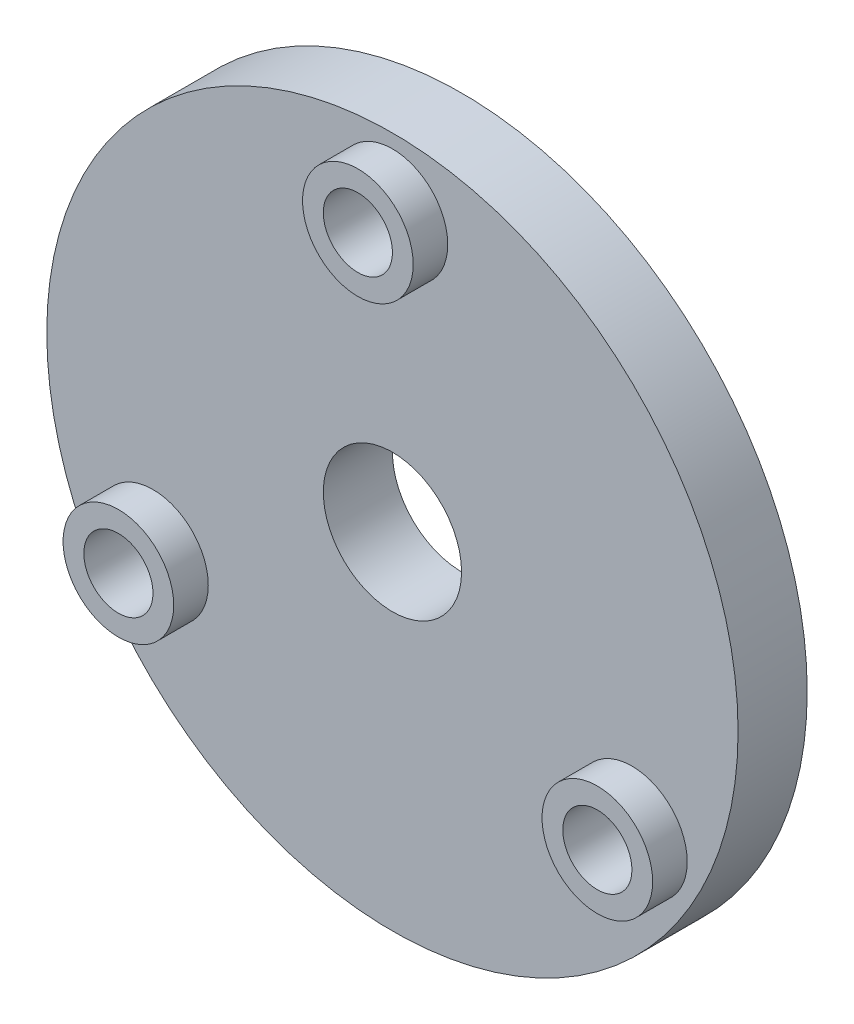
ISO-10303-21;
HEADER;
FILE_DESCRIPTION(('STEP AP214'),'2;1');
FILE_NAME('part.step','',(''),(''),'','','');
FILE_SCHEMA(('AUTOMOTIVE_DESIGN { 1 0 10303 214 1 1 1 1 }'));
ENDSEC;
DATA;
#1=APPLICATION_CONTEXT('core data for automotive mechanical design processes');
#2=APPLICATION_PROTOCOL_DEFINITION('international standard','automotive_design',2000,#1);
#3=PRODUCT_CONTEXT('',#1,'mechanical');
#4=PRODUCT('Part','Part','',(#3));
#5=PRODUCT_RELATED_PRODUCT_CATEGORY('part','',(#4));
#6=PRODUCT_DEFINITION_FORMATION('','',#4);
#7=PRODUCT_DEFINITION_CONTEXT('part definition',#1,'design');
#8=PRODUCT_DEFINITION('design','',#6,#7);
#9=PRODUCT_DEFINITION_SHAPE('','',#8);
#10=(LENGTH_UNIT() NAMED_UNIT(*) SI_UNIT(.MILLI.,.METRE.));
#11=(NAMED_UNIT(*) PLANE_ANGLE_UNIT() SI_UNIT($,.RADIAN.));
#12=(NAMED_UNIT(*) SI_UNIT($,.STERADIAN.) SOLID_ANGLE_UNIT());
#13=UNCERTAINTY_MEASURE_WITH_UNIT(LENGTH_MEASURE(1.E-05),#10,'distance_accuracy_value','');
#14=(GEOMETRIC_REPRESENTATION_CONTEXT(3) GLOBAL_UNCERTAINTY_ASSIGNED_CONTEXT((#13)) GLOBAL_UNIT_ASSIGNED_CONTEXT((#10,
#11,#12)) REPRESENTATION_CONTEXT('',''));
#15=CARTESIAN_POINT('',(0.,0.,0.));
#16=DIRECTION('',(0.,0.,1.));
#17=DIRECTION('',(1.,0.,0.));
#18=AXIS2_PLACEMENT_3D('',#15,#16,#17);
#19=CARTESIAN_POINT('',(0.,0.,10.));
#20=DIRECTION('',(0.,0.,1.));
#21=DIRECTION('',(1.,0.,0.));
#22=AXIS2_PLACEMENT_3D('',#19,#20,#21);
#23=PLANE('',#22);
#24=CARTESIAN_POINT('',(-34.6410161513774,-20.0000000000003,10.));
#25=DIRECTION('',(0.,0.,1.));
#26=DIRECTION('',(-0.500000000000004,0.866025403784436,0.));
#27=AXIS2_PLACEMENT_3D('',#24,#25,#26);
#28=CIRCLE('',#27,8.);
#29=CARTESIAN_POINT('',(-38.6410161513774,-13.0717967697248,10.));
#30=VERTEX_POINT('',#29);
#31=EDGE_CURVE('E74',#30,#30,#28,.T.);
#32=ORIENTED_EDGE('',*,*,#31,.F.);
#33=EDGE_LOOP('',(#32));
#34=FACE_BOUND('',#33,.T.);
#35=CARTESIAN_POINT('',(0.,0.,10.));
#36=DIRECTION('',(0.,0.,1.));
#37=DIRECTION('',(1.,0.,0.));
#38=AXIS2_PLACEMENT_3D('',#35,#36,#37);
#39=CIRCLE('',#38,10.);
#40=CARTESIAN_POINT('',(10.,0.,10.));
#41=VERTEX_POINT('',#40);
#42=EDGE_CURVE('E48',#41,#41,#39,.T.);
#43=ORIENTED_EDGE('',*,*,#42,.F.);
#44=EDGE_LOOP('',(#43));
#45=FACE_BOUND('',#44,.T.);
#46=CARTESIAN_POINT('',(0.,0.,10.));
#47=DIRECTION('',(0.,0.,1.));
#48=DIRECTION('',(1.,0.,0.));
#49=AXIS2_PLACEMENT_3D('',#46,#47,#48);
#50=CIRCLE('',#49,50.);
#51=CARTESIAN_POINT('',(50.,0.,10.));
#52=VERTEX_POINT('',#51);
#53=EDGE_CURVE('E10',#52,#52,#50,.T.);
#54=ORIENTED_EDGE('',*,*,#53,.T.);
#55=EDGE_LOOP('',(#54));
#56=FACE_BOUND('',#55,.T.);
#57=CARTESIAN_POINT('',(-1.5182299861749E-13,40.,10.));
#58=DIRECTION('',(0.,0.,1.));
#59=DIRECTION('',(1.,0.,0.));
#60=AXIS2_PLACEMENT_3D('',#57,#58,#59);
#61=CIRCLE('',#60,8.);
#62=CARTESIAN_POINT('',(7.99999999999985,40.,10.));
#63=VERTEX_POINT('',#62);
#64=EDGE_CURVE('E65',#63,#63,#61,.T.);
#65=ORIENTED_EDGE('',*,*,#64,.F.);
#66=EDGE_LOOP('',(#65));
#67=FACE_BOUND('',#66,.T.);
#68=CARTESIAN_POINT('',(34.6410161513778,-19.9999999999995,10.));
#69=DIRECTION('',(0.,0.,1.));
#70=DIRECTION('',(-0.499999999999992,-0.866025403784443,0.));
#71=AXIS2_PLACEMENT_3D('',#68,#69,#70);
#72=CIRCLE('',#71,8.);
#73=CARTESIAN_POINT('',(30.6410161513779,-26.9282032302751,10.));
#74=VERTEX_POINT('',#73);
#75=EDGE_CURVE('E83',#74,#74,#72,.T.);
#76=ORIENTED_EDGE('',*,*,#75,.F.);
#77=EDGE_LOOP('',(#76));
#78=FACE_BOUND('',#77,.T.);
#79=ADVANCED_FACE('F37',(#34,#45,#56,#67,#78),#23,.T.);
#80=CARTESIAN_POINT('',(0.,0.,0.));
#81=DIRECTION('',(0.,0.,1.));
#82=DIRECTION('',(1.,0.,0.));
#83=AXIS2_PLACEMENT_3D('',#80,#81,#82);
#84=PLANE('',#83);
#85=CARTESIAN_POINT('',(-34.6410161513774,-20.0000000000003,0.));
#86=DIRECTION('',(0.,0.,1.));
#87=DIRECTION('',(-0.500000000000004,0.866025403784436,0.));
#88=AXIS2_PLACEMENT_3D('',#85,#86,#87);
#89=CIRCLE('',#88,5.);
#90=CARTESIAN_POINT('',(-37.1410161513774,-15.6698729810781,0.));
#91=VERTEX_POINT('',#90);
#92=EDGE_CURVE('E58',#91,#91,#89,.T.);
#93=ORIENTED_EDGE('',*,*,#92,.T.);
#94=EDGE_LOOP('',(#93));
#95=FACE_BOUND('',#94,.T.);
#96=CARTESIAN_POINT('',(34.6410161513778,-19.9999999999995,0.));
#97=DIRECTION('',(0.,0.,1.));
#98=DIRECTION('',(-0.499999999999992,-0.866025403784443,0.));
#99=AXIS2_PLACEMENT_3D('',#96,#97,#98);
#100=CIRCLE('',#99,5.);
#101=CARTESIAN_POINT('',(32.1410161513778,-24.3301270189218,0.));
#102=VERTEX_POINT('',#101);
#103=EDGE_CURVE('E59',#102,#102,#100,.T.);
#104=ORIENTED_EDGE('',*,*,#103,.T.);
#105=EDGE_LOOP('',(#104));
#106=FACE_BOUND('',#105,.T.);
#107=CARTESIAN_POINT('',(-1.5182299861749E-13,40.,0.));
#108=DIRECTION('',(0.,0.,1.));
#109=DIRECTION('',(1.,0.,0.));
#110=AXIS2_PLACEMENT_3D('',#107,#108,#109);
#111=CIRCLE('',#110,5.);
#112=CARTESIAN_POINT('',(4.99999999999985,40.,0.));
#113=VERTEX_POINT('',#112);
#114=EDGE_CURVE('E53',#113,#113,#111,.T.);
#115=ORIENTED_EDGE('',*,*,#114,.T.);
#116=EDGE_LOOP('',(#115));
#117=FACE_BOUND('',#116,.T.);
#118=CARTESIAN_POINT('',(0.,0.,0.));
#119=DIRECTION('',(0.,0.,1.));
#120=DIRECTION('',(1.,0.,0.));
#121=AXIS2_PLACEMENT_3D('',#118,#119,#120);
#122=CIRCLE('',#121,50.);
#123=CARTESIAN_POINT('',(50.,0.,0.));
#124=VERTEX_POINT('',#123);
#125=EDGE_CURVE('E41',#124,#124,#122,.T.);
#126=ORIENTED_EDGE('',*,*,#125,.F.);
#127=EDGE_LOOP('',(#126));
#128=FACE_BOUND('',#127,.T.);
#129=CARTESIAN_POINT('',(0.,0.,0.));
#130=DIRECTION('',(0.,0.,1.));
#131=DIRECTION('',(1.,0.,0.));
#132=AXIS2_PLACEMENT_3D('',#129,#130,#131);
#133=CIRCLE('',#132,10.);
#134=CARTESIAN_POINT('',(10.,0.,0.));
#135=VERTEX_POINT('',#134);
#136=EDGE_CURVE('E50',#135,#135,#133,.T.);
#137=ORIENTED_EDGE('',*,*,#136,.T.);
#138=EDGE_LOOP('',(#137));
#139=FACE_BOUND('',#138,.T.);
#140=ADVANCED_FACE('F110',(#95,#106,#117,#128,#139),#84,.F.);
#141=CARTESIAN_POINT('',(0.,0.,10.));
#142=DIRECTION('',(0.,0.,-1.));
#143=DIRECTION('',(-1.,0.,0.));
#144=AXIS2_PLACEMENT_3D('',#141,#142,#143);
#145=CYLINDRICAL_SURFACE('',#144,50.);
#146=ORIENTED_EDGE('',*,*,#53,.F.);
#147=EDGE_LOOP('',(#146));
#148=FACE_BOUND('',#147,.T.);
#149=ORIENTED_EDGE('',*,*,#125,.T.);
#150=EDGE_LOOP('',(#149));
#151=FACE_BOUND('',#150,.T.);
#152=ADVANCED_FACE('F39',(#148,#151),#145,.T.);
#153=CARTESIAN_POINT('',(0.,0.,10.));
#154=DIRECTION('',(0.,0.,-1.));
#155=DIRECTION('',(-1.,0.,0.));
#156=AXIS2_PLACEMENT_3D('',#153,#154,#155);
#157=CYLINDRICAL_SURFACE('',#156,10.);
#158=ORIENTED_EDGE('',*,*,#42,.T.);
#159=EDGE_LOOP('',(#158));
#160=FACE_BOUND('',#159,.T.);
#161=ORIENTED_EDGE('',*,*,#136,.F.);
#162=EDGE_LOOP('',(#161));
#163=FACE_BOUND('',#162,.T.);
#164=ADVANCED_FACE('F122',(#160,#163),#157,.F.);
#165=CARTESIAN_POINT('',(-1.5182299861749E-13,40.,10.));
#166=DIRECTION('',(0.,0.,-1.));
#167=DIRECTION('',(-1.,0.,0.));
#168=AXIS2_PLACEMENT_3D('',#165,#166,#167);
#169=CYLINDRICAL_SURFACE('',#168,5.);
#170=ORIENTED_EDGE('',*,*,#114,.F.);
#171=EDGE_LOOP('',(#170));
#172=FACE_BOUND('',#171,.T.);
#173=CARTESIAN_POINT('',(-1.5182299861749E-13,40.,15.));
#174=DIRECTION('',(0.,0.,1.));
#175=DIRECTION('',(1.,0.,0.));
#176=AXIS2_PLACEMENT_3D('',#173,#174,#175);
#177=CIRCLE('',#176,5.);
#178=CARTESIAN_POINT('',(4.99999999999985,40.,15.));
#179=VERTEX_POINT('',#178);
#180=EDGE_CURVE('E68',#179,#179,#177,.T.);
#181=ORIENTED_EDGE('',*,*,#180,.T.);
#182=EDGE_LOOP('',(#181));
#183=FACE_BOUND('',#182,.T.);
#184=ADVANCED_FACE('F125',(#172,#183),#169,.F.);
#185=CARTESIAN_POINT('',(34.6410161513778,-19.9999999999995,10.));
#186=DIRECTION('',(0.,0.,-1.));
#187=DIRECTION('',(-1.,0.,0.));
#188=AXIS2_PLACEMENT_3D('',#185,#186,#187);
#189=CYLINDRICAL_SURFACE('',#188,5.);
#190=ORIENTED_EDGE('',*,*,#103,.F.);
#191=EDGE_LOOP('',(#190));
#192=FACE_BOUND('',#191,.T.);
#193=CARTESIAN_POINT('',(34.6410161513778,-19.9999999999995,15.));
#194=DIRECTION('',(0.,0.,1.));
#195=DIRECTION('',(-0.499999999999992,-0.866025403784443,0.));
#196=AXIS2_PLACEMENT_3D('',#193,#194,#195);
#197=CIRCLE('',#196,5.);
#198=CARTESIAN_POINT('',(32.1410161513778,-24.3301270189218,15.));
#199=VERTEX_POINT('',#198);
#200=EDGE_CURVE('E86',#199,#199,#197,.T.);
#201=ORIENTED_EDGE('',*,*,#200,.T.);
#202=EDGE_LOOP('',(#201));
#203=FACE_BOUND('',#202,.T.);
#204=ADVANCED_FACE('F92',(#192,#203),#189,.F.);
#205=CARTESIAN_POINT('',(-34.6410161513774,-20.0000000000003,10.));
#206=DIRECTION('',(0.,0.,-1.));
#207=DIRECTION('',(-1.,0.,0.));
#208=AXIS2_PLACEMENT_3D('',#205,#206,#207);
#209=CYLINDRICAL_SURFACE('',#208,5.);
#210=ORIENTED_EDGE('',*,*,#92,.F.);
#211=EDGE_LOOP('',(#210));
#212=FACE_BOUND('',#211,.T.);
#213=CARTESIAN_POINT('',(-34.6410161513774,-20.0000000000003,15.));
#214=DIRECTION('',(0.,0.,1.));
#215=DIRECTION('',(-0.500000000000004,0.866025403784436,0.));
#216=AXIS2_PLACEMENT_3D('',#213,#214,#215);
#217=CIRCLE('',#216,5.);
#218=CARTESIAN_POINT('',(-37.1410161513774,-15.6698729810781,15.));
#219=VERTEX_POINT('',#218);
#220=EDGE_CURVE('E77',#219,#219,#217,.T.);
#221=ORIENTED_EDGE('',*,*,#220,.T.);
#222=EDGE_LOOP('',(#221));
#223=FACE_BOUND('',#222,.T.);
#224=ADVANCED_FACE('F131',(#212,#223),#209,.F.);
#225=CARTESIAN_POINT('',(-1.5182299861749E-13,40.,15.));
#226=DIRECTION('',(0.,0.,1.));
#227=DIRECTION('',(1.,0.,0.));
#228=AXIS2_PLACEMENT_3D('',#225,#226,#227);
#229=PLANE('',#228);
#230=CARTESIAN_POINT('',(-1.5182299861749E-13,40.,15.));
#231=DIRECTION('',(0.,0.,1.));
#232=DIRECTION('',(1.,0.,0.));
#233=AXIS2_PLACEMENT_3D('',#230,#231,#232);
#234=CIRCLE('',#233,8.);
#235=CARTESIAN_POINT('',(7.99999999999985,40.,15.));
#236=VERTEX_POINT('',#235);
#237=EDGE_CURVE('E62',#236,#236,#234,.T.);
#238=ORIENTED_EDGE('',*,*,#237,.T.);
#239=EDGE_LOOP('',(#238));
#240=FACE_BOUND('',#239,.T.);
#241=ORIENTED_EDGE('',*,*,#180,.F.);
#242=EDGE_LOOP('',(#241));
#243=FACE_BOUND('',#242,.T.);
#244=ADVANCED_FACE('F135',(#240,#243),#229,.T.);
#245=CARTESIAN_POINT('',(-1.5182299861749E-13,40.,15.));
#246=DIRECTION('',(0.,0.,-1.));
#247=DIRECTION('',(-1.,0.,0.));
#248=AXIS2_PLACEMENT_3D('',#245,#246,#247);
#249=CYLINDRICAL_SURFACE('',#248,8.);
#250=ORIENTED_EDGE('',*,*,#237,.F.);
#251=EDGE_LOOP('',(#250));
#252=FACE_BOUND('',#251,.T.);
#253=ORIENTED_EDGE('',*,*,#64,.T.);
#254=EDGE_LOOP('',(#253));
#255=FACE_BOUND('',#254,.T.);
#256=ADVANCED_FACE('F137',(#252,#255),#249,.T.);
#257=CARTESIAN_POINT('',(-34.6410161513774,-20.0000000000003,15.));
#258=DIRECTION('',(0.,0.,1.));
#259=DIRECTION('',(-0.500000000000004,0.866025403784436,0.));
#260=AXIS2_PLACEMENT_3D('',#257,#258,#259);
#261=PLANE('',#260);
#262=CARTESIAN_POINT('',(-34.6410161513774,-20.0000000000003,15.));
#263=DIRECTION('',(0.,0.,1.));
#264=DIRECTION('',(-0.500000000000004,0.866025403784436,0.));
#265=AXIS2_PLACEMENT_3D('',#262,#263,#264);
#266=CIRCLE('',#265,8.);
#267=CARTESIAN_POINT('',(-38.6410161513774,-13.0717967697248,15.));
#268=VERTEX_POINT('',#267);
#269=EDGE_CURVE('E73',#268,#268,#266,.T.);
#270=ORIENTED_EDGE('',*,*,#269,.T.);
#271=EDGE_LOOP('',(#270));
#272=FACE_BOUND('',#271,.T.);
#273=ORIENTED_EDGE('',*,*,#220,.F.);
#274=EDGE_LOOP('',(#273));
#275=FACE_BOUND('',#274,.T.);
#276=ADVANCED_FACE('F106',(#272,#275),#261,.T.);
#277=CARTESIAN_POINT('',(-34.6410161513774,-20.0000000000003,15.));
#278=DIRECTION('',(0.,0.,-1.));
#279=DIRECTION('',(-1.,0.,0.));
#280=AXIS2_PLACEMENT_3D('',#277,#278,#279);
#281=CYLINDRICAL_SURFACE('',#280,8.);
#282=ORIENTED_EDGE('',*,*,#269,.F.);
#283=EDGE_LOOP('',(#282));
#284=FACE_BOUND('',#283,.T.);
#285=ORIENTED_EDGE('',*,*,#31,.T.);
#286=EDGE_LOOP('',(#285));
#287=FACE_BOUND('',#286,.T.);
#288=ADVANCED_FACE('F97',(#284,#287),#281,.T.);
#289=CARTESIAN_POINT('',(34.6410161513778,-19.9999999999995,15.));
#290=DIRECTION('',(0.,0.,1.));
#291=DIRECTION('',(-0.499999999999992,-0.866025403784443,0.));
#292=AXIS2_PLACEMENT_3D('',#289,#290,#291);
#293=PLANE('',#292);
#294=CARTESIAN_POINT('',(34.6410161513778,-19.9999999999995,15.));
#295=DIRECTION('',(0.,0.,1.));
#296=DIRECTION('',(-0.499999999999992,-0.866025403784443,0.));
#297=AXIS2_PLACEMENT_3D('',#294,#295,#296);
#298=CIRCLE('',#297,8.);
#299=CARTESIAN_POINT('',(30.6410161513779,-26.9282032302751,15.));
#300=VERTEX_POINT('',#299);
#301=EDGE_CURVE('E82',#300,#300,#298,.T.);
#302=ORIENTED_EDGE('',*,*,#301,.T.);
#303=EDGE_LOOP('',(#302));
#304=FACE_BOUND('',#303,.T.);
#305=ORIENTED_EDGE('',*,*,#200,.F.);
#306=EDGE_LOOP('',(#305));
#307=FACE_BOUND('',#306,.T.);
#308=ADVANCED_FACE('F94',(#304,#307),#293,.T.);
#309=CARTESIAN_POINT('',(34.6410161513778,-19.9999999999995,15.));
#310=DIRECTION('',(0.,0.,-1.));
#311=DIRECTION('',(-1.,0.,0.));
#312=AXIS2_PLACEMENT_3D('',#309,#310,#311);
#313=CYLINDRICAL_SURFACE('',#312,8.);
#314=ORIENTED_EDGE('',*,*,#301,.F.);
#315=EDGE_LOOP('',(#314));
#316=FACE_BOUND('',#315,.T.);
#317=ORIENTED_EDGE('',*,*,#75,.T.);
#318=EDGE_LOOP('',(#317));
#319=FACE_BOUND('',#318,.T.);
#320=ADVANCED_FACE('F96',(#316,#319),#313,.T.);
#321=CLOSED_SHELL('',(#79,#140,#152,#164,#184,#204,#224,#244,#256,#276,#288,#308,#320));
#322=MANIFOLD_SOLID_BREP('B2',#321);
#323=ADVANCED_BREP_SHAPE_REPRESENTATION('',(#18,#322),#14);
#324=SHAPE_DEFINITION_REPRESENTATION(#9,#323);
ENDSEC;
END-ISO-10303-21;
